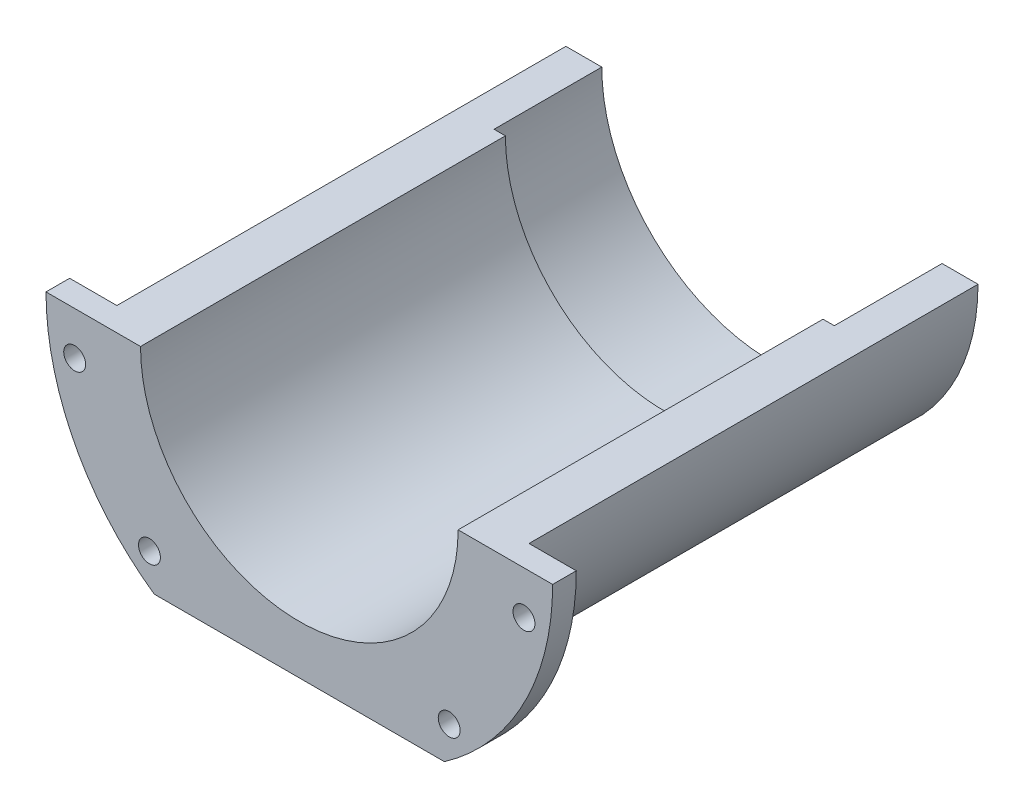
ISO-10303-21;
HEADER;
FILE_DESCRIPTION(('STEP AP214'),'2;1');
FILE_NAME('part.step','',(''),(''),'','','');
FILE_SCHEMA(('AUTOMOTIVE_DESIGN { 1 0 10303 214 1 1 1 1 }'));
ENDSEC;
DATA;
#1=APPLICATION_CONTEXT('core data for automotive mechanical design processes');
#2=APPLICATION_PROTOCOL_DEFINITION('international standard','automotive_design',2000,#1);
#3=PRODUCT_CONTEXT('',#1,'mechanical');
#4=PRODUCT('Part','Part','',(#3));
#5=PRODUCT_RELATED_PRODUCT_CATEGORY('part','',(#4));
#6=PRODUCT_DEFINITION_FORMATION('','',#4);
#7=PRODUCT_DEFINITION_CONTEXT('part definition',#1,'design');
#8=PRODUCT_DEFINITION('design','',#6,#7);
#9=PRODUCT_DEFINITION_SHAPE('','',#8);
#10=(LENGTH_UNIT() NAMED_UNIT(*) SI_UNIT(.MILLI.,.METRE.));
#11=(NAMED_UNIT(*) PLANE_ANGLE_UNIT() SI_UNIT($,.RADIAN.));
#12=(NAMED_UNIT(*) SI_UNIT($,.STERADIAN.) SOLID_ANGLE_UNIT());
#13=UNCERTAINTY_MEASURE_WITH_UNIT(LENGTH_MEASURE(1.E-05),#10,'distance_accuracy_value','');
#14=(GEOMETRIC_REPRESENTATION_CONTEXT(3) GLOBAL_UNCERTAINTY_ASSIGNED_CONTEXT((#13)) GLOBAL_UNIT_ASSIGNED_CONTEXT((#10,
#11,#12)) REPRESENTATION_CONTEXT('',''));
#15=CARTESIAN_POINT('',(0.,0.,0.));
#16=DIRECTION('',(0.,0.,1.));
#17=DIRECTION('',(1.,0.,0.));
#18=AXIS2_PLACEMENT_3D('',#15,#16,#17);
#19=CARTESIAN_POINT('',(0.,0.,63.5));
#20=DIRECTION('',(0.,0.,-1.));
#21=DIRECTION('',(-1.,0.,0.));
#22=AXIS2_PLACEMENT_3D('',#19,#20,#21);
#23=CYLINDRICAL_SURFACE('',#22,21.336);
#24=DIRECTION('',(0.,0.,-1.));
#25=VECTOR('',#24,1.);
#26=CARTESIAN_POINT('',(21.336,0.,63.5));
#27=LINE('',#26,#25);
#28=CARTESIAN_POINT('',(21.336,0.,14.478));
#29=VERTEX_POINT('',#28);
#30=CARTESIAN_POINT('',(21.336,0.,63.5));
#31=VERTEX_POINT('',#30);
#32=EDGE_CURVE('E152',#29,#31,#27,.F.);
#33=ORIENTED_EDGE('',*,*,#32,.F.);
#34=CARTESIAN_POINT('',(0.,0.,14.478));
#35=DIRECTION('',(0.,0.,-1.));
#36=DIRECTION('',(-1.,0.,0.));
#37=AXIS2_PLACEMENT_3D('',#34,#35,#36);
#38=CIRCLE('',#37,21.336);
#39=CARTESIAN_POINT('',(-21.336,0.,14.478));
#40=VERTEX_POINT('',#39);
#41=EDGE_CURVE('E198',#29,#40,#38,.T.);
#42=ORIENTED_EDGE('',*,*,#41,.T.);
#43=DIRECTION('',(0.,0.,-1.));
#44=VECTOR('',#43,1.);
#45=CARTESIAN_POINT('',(-21.336,0.,63.5));
#46=LINE('',#45,#44);
#47=CARTESIAN_POINT('',(-21.336,0.,63.5));
#48=VERTEX_POINT('',#47);
#49=EDGE_CURVE('E143',#48,#40,#46,.T.);
#50=ORIENTED_EDGE('',*,*,#49,.F.);
#51=CARTESIAN_POINT('',(0.,0.,63.5));
#52=DIRECTION('',(0.,0.,1.));
#53=DIRECTION('',(1.,0.,0.));
#54=AXIS2_PLACEMENT_3D('',#51,#52,#53);
#55=CIRCLE('',#54,21.336);
#56=EDGE_CURVE('E215',#48,#31,#55,.T.);
#57=ORIENTED_EDGE('',*,*,#56,.T.);
#58=EDGE_LOOP('',(#33,#42,#50,#57));
#59=FACE_BOUND('',#58,.T.);
#60=ADVANCED_FACE('F44',(#59),#23,.F.);
#61=CARTESIAN_POINT('',(0.,0.,60.325));
#62=DIRECTION('',(0.,0.,1.));
#63=DIRECTION('',(1.,0.,0.));
#64=AXIS2_PLACEMENT_3D('',#61,#62,#63);
#65=CYLINDRICAL_SURFACE('',#64,34.036);
#66=DIRECTION('',(0.,0.,1.));
#67=VECTOR('',#66,1.);
#68=CARTESIAN_POINT('',(-19.4962163427083,-27.8988681547892,60.325));
#69=LINE('',#68,#67);
#70=CARTESIAN_POINT('',(-19.4962163427083,-27.8988681547892,63.5));
#71=VERTEX_POINT('',#70);
#72=CARTESIAN_POINT('',(-19.4962163427083,-27.8988681547892,60.325));
#73=VERTEX_POINT('',#72);
#74=EDGE_CURVE('E66',#71,#73,#69,.F.);
#75=ORIENTED_EDGE('',*,*,#74,.F.);
#76=CARTESIAN_POINT('',(0.,0.,63.5));
#77=DIRECTION('',(0.,0.,1.));
#78=DIRECTION('',(1.,0.,0.));
#79=AXIS2_PLACEMENT_3D('',#76,#77,#78);
#80=CIRCLE('',#79,34.036);
#81=CARTESIAN_POINT('',(-34.036,0.,63.5));
#82=VERTEX_POINT('',#81);
#83=EDGE_CURVE('E141',#82,#71,#80,.T.);
#84=ORIENTED_EDGE('',*,*,#83,.F.);
#85=DIRECTION('',(0.,0.,1.));
#86=VECTOR('',#85,1.);
#87=CARTESIAN_POINT('',(-34.036,0.,60.325));
#88=LINE('',#87,#86);
#89=CARTESIAN_POINT('',(-34.036,0.,60.325));
#90=VERTEX_POINT('',#89);
#91=EDGE_CURVE('E147',#90,#82,#88,.T.);
#92=ORIENTED_EDGE('',*,*,#91,.F.);
#93=CARTESIAN_POINT('',(0.,0.,60.325));
#94=DIRECTION('',(0.,0.,1.));
#95=DIRECTION('',(1.,0.,0.));
#96=AXIS2_PLACEMENT_3D('',#93,#94,#95);
#97=CIRCLE('',#96,34.036);
#98=EDGE_CURVE('E210',#90,#73,#97,.T.);
#99=ORIENTED_EDGE('',*,*,#98,.T.);
#100=EDGE_LOOP('',(#75,#84,#92,#99));
#101=FACE_BOUND('',#100,.T.);
#102=ADVANCED_FACE('F232',(#101),#65,.T.);
#103=CARTESIAN_POINT('',(0.,0.,63.5));
#104=DIRECTION('',(0.,0.,-1.));
#105=DIRECTION('',(-1.,0.,0.));
#106=AXIS2_PLACEMENT_3D('',#103,#104,#105);
#107=CYLINDRICAL_SURFACE('',#106,27.686);
#108=CARTESIAN_POINT('',(0.,0.,60.325));
#109=DIRECTION('',(0.,0.,1.));
#110=DIRECTION('',(1.,0.,0.));
#111=AXIS2_PLACEMENT_3D('',#108,#109,#110);
#112=CIRCLE('',#111,27.686);
#113=CARTESIAN_POINT('',(-27.686,0.,60.325));
#114=VERTEX_POINT('',#113);
#115=CARTESIAN_POINT('',(27.686,0.,60.325));
#116=VERTEX_POINT('',#115);
#117=EDGE_CURVE('E217',#114,#116,#112,.T.);
#118=ORIENTED_EDGE('',*,*,#117,.F.);
#119=DIRECTION('',(0.,0.,-1.));
#120=VECTOR('',#119,1.);
#121=CARTESIAN_POINT('',(-27.686,0.,63.5));
#122=LINE('',#121,#120);
#123=CARTESIAN_POINT('',(-27.686,0.,0.));
#124=VERTEX_POINT('',#123);
#125=EDGE_CURVE('E138',#114,#124,#122,.T.);
#126=ORIENTED_EDGE('',*,*,#125,.T.);
#127=CARTESIAN_POINT('',(0.,0.,0.));
#128=DIRECTION('',(0.,0.,1.));
#129=DIRECTION('',(1.,0.,0.));
#130=AXIS2_PLACEMENT_3D('',#127,#128,#129);
#131=CIRCLE('',#130,27.686);
#132=CARTESIAN_POINT('',(27.686,0.,0.));
#133=VERTEX_POINT('',#132);
#134=EDGE_CURVE('E136',#124,#133,#131,.T.);
#135=ORIENTED_EDGE('',*,*,#134,.T.);
#136=DIRECTION('',(0.,0.,-1.));
#137=VECTOR('',#136,1.);
#138=CARTESIAN_POINT('',(27.686,0.,63.5));
#139=LINE('',#138,#137);
#140=EDGE_CURVE('E148',#133,#116,#139,.F.);
#141=ORIENTED_EDGE('',*,*,#140,.T.);
#142=EDGE_LOOP('',(#118,#126,#135,#141));
#143=FACE_BOUND('',#142,.T.);
#144=ADVANCED_FACE('F229',(#143),#107,.T.);
#145=CARTESIAN_POINT('',(0.,0.,63.5));
#146=DIRECTION('',(0.,0.,1.));
#147=DIRECTION('',(1.,0.,0.));
#148=AXIS2_PLACEMENT_3D('',#145,#146,#147);
#149=PLANE('',#148);
#150=DIRECTION('',(-1.,0.,0.));
#151=VECTOR('',#150,1.);
#152=CARTESIAN_POINT('',(0.,-27.8988681547892,63.5));
#153=LINE('',#152,#151);
#154=CARTESIAN_POINT('',(19.4962163427083,-27.8988681547892,63.5));
#155=VERTEX_POINT('',#154);
#156=EDGE_CURVE('E189',#155,#71,#153,.T.);
#157=ORIENTED_EDGE('',*,*,#156,.F.);
#158=CARTESIAN_POINT('',(34.036,0.,63.5));
#159=VERTEX_POINT('',#158);
#160=EDGE_CURVE('E137',#155,#159,#80,.T.);
#161=ORIENTED_EDGE('',*,*,#160,.T.);
#162=DIRECTION('',(1.,0.,0.));
#163=VECTOR('',#162,1.);
#164=CARTESIAN_POINT('',(0.,0.,63.5));
#165=LINE('',#164,#163);
#166=EDGE_CURVE('E156',#31,#159,#165,.T.);
#167=ORIENTED_EDGE('',*,*,#166,.F.);
#168=ORIENTED_EDGE('',*,*,#56,.F.);
#169=EDGE_CURVE('E150',#82,#48,#165,.T.);
#170=ORIENTED_EDGE('',*,*,#169,.F.);
#171=ORIENTED_EDGE('',*,*,#83,.T.);
#172=EDGE_LOOP('',(#157,#161,#167,#168,#170,#171));
#173=FACE_BOUND('',#172,.T.);
#174=CARTESIAN_POINT('',(30.1839089543415,-5.78978251153393,63.5));
#175=DIRECTION('',(0.,0.,1.));
#176=DIRECTION('',(1.,0.,0.));
#177=AXIS2_PLACEMENT_3D('',#174,#175,#176);
#178=CIRCLE('',#177,1.4732);
#179=CARTESIAN_POINT('',(31.6571089543415,-5.78978251153393,63.5));
#180=VERTEX_POINT('',#179);
#181=EDGE_CURVE('E164',#180,#180,#178,.T.);
#182=ORIENTED_EDGE('',*,*,#181,.F.);
#183=EDGE_LOOP('',(#182));
#184=FACE_BOUND('',#183,.T.);
#185=CARTESIAN_POINT('',(-30.1839089543415,-5.78978251153393,63.5));
#186=DIRECTION('',(0.,0.,1.));
#187=DIRECTION('',(1.,0.,0.));
#188=AXIS2_PLACEMENT_3D('',#185,#186,#187);
#189=CIRCLE('',#188,1.4732);
#190=CARTESIAN_POINT('',(-28.7107089543415,-5.78978251153393,63.5));
#191=VERTEX_POINT('',#190);
#192=EDGE_CURVE('E167',#191,#191,#189,.T.);
#193=ORIENTED_EDGE('',*,*,#192,.F.);
#194=EDGE_LOOP('',(#193));
#195=FACE_BOUND('',#194,.T.);
#196=CARTESIAN_POINT('',(-20.1371679323559,-23.2181913369439,63.5));
#197=DIRECTION('',(0.,0.,1.));
#198=DIRECTION('',(1.,0.,0.));
#199=AXIS2_PLACEMENT_3D('',#196,#197,#198);
#200=CIRCLE('',#199,1.4732);
#201=CARTESIAN_POINT('',(-18.6639679323559,-23.2181913369439,63.5));
#202=VERTEX_POINT('',#201);
#203=EDGE_CURVE('E170',#202,#202,#200,.T.);
#204=ORIENTED_EDGE('',*,*,#203,.F.);
#205=EDGE_LOOP('',(#204));
#206=FACE_BOUND('',#205,.T.);
#207=CARTESIAN_POINT('',(20.1371679323559,-23.2181913369439,63.5));
#208=DIRECTION('',(0.,0.,1.));
#209=DIRECTION('',(1.,0.,0.));
#210=AXIS2_PLACEMENT_3D('',#207,#208,#209);
#211=CIRCLE('',#210,1.4732);
#212=CARTESIAN_POINT('',(21.6103679323559,-23.2181913369439,63.5));
#213=VERTEX_POINT('',#212);
#214=EDGE_CURVE('E173',#213,#213,#211,.T.);
#215=ORIENTED_EDGE('',*,*,#214,.F.);
#216=EDGE_LOOP('',(#215));
#217=FACE_BOUND('',#216,.T.);
#218=ADVANCED_FACE('F231',(#173,#184,#195,#206,#217),#149,.T.);
#219=CARTESIAN_POINT('',(0.,0.,0.));
#220=DIRECTION('',(0.,0.,1.));
#221=DIRECTION('',(1.,0.,0.));
#222=AXIS2_PLACEMENT_3D('',#219,#220,#221);
#223=PLANE('',#222);
#224=DIRECTION('',(1.,0.,0.));
#225=VECTOR('',#224,1.);
#226=CARTESIAN_POINT('',(0.,0.,0.));
#227=LINE('',#226,#225);
#228=CARTESIAN_POINT('',(-22.86,0.,0.));
#229=VERTEX_POINT('',#228);
#230=EDGE_CURVE('E130',#124,#229,#227,.T.);
#231=ORIENTED_EDGE('',*,*,#230,.T.);
#232=CARTESIAN_POINT('',(0.,0.,0.));
#233=DIRECTION('',(0.,0.,-1.));
#234=DIRECTION('',(-1.,0.,0.));
#235=AXIS2_PLACEMENT_3D('',#232,#233,#234);
#236=CIRCLE('',#235,22.86);
#237=CARTESIAN_POINT('',(22.86,0.,0.));
#238=VERTEX_POINT('',#237);
#239=EDGE_CURVE('E119',#238,#229,#236,.T.);
#240=ORIENTED_EDGE('',*,*,#239,.F.);
#241=EDGE_CURVE('E140',#238,#133,#227,.T.);
#242=ORIENTED_EDGE('',*,*,#241,.T.);
#243=ORIENTED_EDGE('',*,*,#134,.F.);
#244=EDGE_LOOP('',(#231,#240,#242,#243));
#245=FACE_BOUND('',#244,.T.);
#246=ADVANCED_FACE('F134',(#245),#223,.F.);
#247=DIRECTION('',(0.,0.,1.));
#248=VECTOR('',#247,1.);
#249=CARTESIAN_POINT('',(19.4962163427083,-27.8988681547892,60.325));
#250=LINE('',#249,#248);
#251=CARTESIAN_POINT('',(19.4962163427083,-27.8988681547892,60.325));
#252=VERTEX_POINT('',#251);
#253=EDGE_CURVE('E191',#252,#155,#250,.T.);
#254=ORIENTED_EDGE('',*,*,#253,.F.);
#255=CARTESIAN_POINT('',(34.036,0.,60.325));
#256=VERTEX_POINT('',#255);
#257=EDGE_CURVE('E212',#252,#256,#97,.T.);
#258=ORIENTED_EDGE('',*,*,#257,.T.);
#259=DIRECTION('',(0.,0.,1.));
#260=VECTOR('',#259,1.);
#261=CARTESIAN_POINT('',(34.036,0.,60.325));
#262=LINE('',#261,#260);
#263=EDGE_CURVE('E161',#159,#256,#262,.F.);
#264=ORIENTED_EDGE('',*,*,#263,.F.);
#265=ORIENTED_EDGE('',*,*,#160,.F.);
#266=EDGE_LOOP('',(#254,#258,#264,#265));
#267=FACE_BOUND('',#266,.T.);
#268=ADVANCED_FACE('F242',(#267),#65,.T.);
#269=CARTESIAN_POINT('',(0.,0.,60.325));
#270=DIRECTION('',(0.,0.,1.));
#271=DIRECTION('',(1.,0.,0.));
#272=AXIS2_PLACEMENT_3D('',#269,#270,#271);
#273=PLANE('',#272);
#274=CARTESIAN_POINT('',(30.1839089543415,-5.78978251153393,60.325));
#275=DIRECTION('',(0.,0.,-1.));
#276=DIRECTION('',(-1.,0.,0.));
#277=AXIS2_PLACEMENT_3D('',#274,#275,#276);
#278=CIRCLE('',#277,1.4732);
#279=CARTESIAN_POINT('',(28.7107089543415,-5.78978251153393,60.325));
#280=VERTEX_POINT('',#279);
#281=EDGE_CURVE('E176',#280,#280,#278,.T.);
#282=ORIENTED_EDGE('',*,*,#281,.F.);
#283=EDGE_LOOP('',(#282));
#284=FACE_BOUND('',#283,.T.);
#285=CARTESIAN_POINT('',(-30.1839089543415,-5.78978251153393,60.325));
#286=DIRECTION('',(0.,0.,-1.));
#287=DIRECTION('',(-1.,0.,0.));
#288=AXIS2_PLACEMENT_3D('',#285,#286,#287);
#289=CIRCLE('',#288,1.4732);
#290=CARTESIAN_POINT('',(-31.6571089543415,-5.78978251153393,60.325));
#291=VERTEX_POINT('',#290);
#292=EDGE_CURVE('E181',#291,#291,#289,.T.);
#293=ORIENTED_EDGE('',*,*,#292,.F.);
#294=EDGE_LOOP('',(#293));
#295=FACE_BOUND('',#294,.T.);
#296=CARTESIAN_POINT('',(-20.1371679323559,-23.2181913369439,60.325));
#297=DIRECTION('',(0.,0.,-1.));
#298=DIRECTION('',(-1.,0.,0.));
#299=AXIS2_PLACEMENT_3D('',#296,#297,#298);
#300=CIRCLE('',#299,1.4732);
#301=CARTESIAN_POINT('',(-21.6103679323559,-23.2181913369439,60.325));
#302=VERTEX_POINT('',#301);
#303=EDGE_CURVE('E177',#302,#302,#300,.T.);
#304=ORIENTED_EDGE('',*,*,#303,.F.);
#305=EDGE_LOOP('',(#304));
#306=FACE_BOUND('',#305,.T.);
#307=CARTESIAN_POINT('',(20.1371679323559,-23.2181913369439,60.325));
#308=DIRECTION('',(0.,0.,-1.));
#309=DIRECTION('',(-1.,0.,0.));
#310=AXIS2_PLACEMENT_3D('',#307,#308,#309);
#311=CIRCLE('',#310,1.4732);
#312=CARTESIAN_POINT('',(18.6639679323559,-23.2181913369439,60.325));
#313=VERTEX_POINT('',#312);
#314=EDGE_CURVE('E180',#313,#313,#311,.T.);
#315=ORIENTED_EDGE('',*,*,#314,.F.);
#316=EDGE_LOOP('',(#315));
#317=FACE_BOUND('',#316,.T.);
#318=ORIENTED_EDGE('',*,*,#257,.F.);
#319=DIRECTION('',(1.,0.,0.));
#320=VECTOR('',#319,1.);
#321=CARTESIAN_POINT('',(22.9354742737972,-27.8988681547892,60.325));
#322=LINE('',#321,#320);
#323=EDGE_CURVE('E193',#73,#252,#322,.T.);
#324=ORIENTED_EDGE('',*,*,#323,.F.);
#325=ORIENTED_EDGE('',*,*,#98,.F.);
#326=DIRECTION('',(1.,0.,0.));
#327=VECTOR('',#326,1.);
#328=CARTESIAN_POINT('',(0.,0.,60.325));
#329=LINE('',#328,#327);
#330=EDGE_CURVE('E222',#90,#114,#329,.T.);
#331=ORIENTED_EDGE('',*,*,#330,.T.);
#332=ORIENTED_EDGE('',*,*,#117,.T.);
#333=EDGE_CURVE('E220',#116,#256,#329,.T.);
#334=ORIENTED_EDGE('',*,*,#333,.T.);
#335=EDGE_LOOP('',(#318,#324,#325,#331,#332,#334));
#336=FACE_BOUND('',#335,.T.);
#337=ADVANCED_FACE('F227',(#284,#295,#306,#317,#336),#273,.F.);
#338=CARTESIAN_POINT('',(45.3508252416647,0.,161.925));
#339=DIRECTION('',(0.,-1.,0.));
#340=DIRECTION('',(0.,0.,-1.));
#341=AXIS2_PLACEMENT_3D('',#338,#339,#340);
#342=PLANE('',#341);
#343=ORIENTED_EDGE('',*,*,#241,.F.);
#344=DIRECTION('',(0.,0.,-1.));
#345=VECTOR('',#344,1.);
#346=CARTESIAN_POINT('',(22.86,0.,14.478));
#347=LINE('',#346,#345);
#348=CARTESIAN_POINT('',(22.86,0.,14.478));
#349=VERTEX_POINT('',#348);
#350=EDGE_CURVE('E123',#238,#349,#347,.F.);
#351=ORIENTED_EDGE('',*,*,#350,.T.);
#352=DIRECTION('',(1.,0.,0.));
#353=VECTOR('',#352,1.);
#354=CARTESIAN_POINT('',(45.3508252416647,0.,14.478));
#355=LINE('',#354,#353);
#356=EDGE_CURVE('E196',#29,#349,#355,.T.);
#357=ORIENTED_EDGE('',*,*,#356,.F.);
#358=ORIENTED_EDGE('',*,*,#32,.T.);
#359=ORIENTED_EDGE('',*,*,#166,.T.);
#360=ORIENTED_EDGE('',*,*,#263,.T.);
#361=ORIENTED_EDGE('',*,*,#333,.F.);
#362=ORIENTED_EDGE('',*,*,#140,.F.);
#363=EDGE_LOOP('',(#343,#351,#357,#358,#359,#360,#361,#362));
#364=FACE_BOUND('',#363,.T.);
#365=ADVANCED_FACE('F265',(#364),#342,.F.);
#366=DIRECTION('',(1.,0.,0.));
#367=VECTOR('',#366,1.);
#368=CARTESIAN_POINT('',(45.3508252416647,0.,14.478));
#369=LINE('',#368,#367);
#370=CARTESIAN_POINT('',(-22.86,0.,14.478));
#371=VERTEX_POINT('',#370);
#372=EDGE_CURVE('E51',#371,#40,#369,.T.);
#373=ORIENTED_EDGE('',*,*,#372,.F.);
#374=DIRECTION('',(0.,0.,-1.));
#375=VECTOR('',#374,1.);
#376=CARTESIAN_POINT('',(-22.86,0.,14.478));
#377=LINE('',#376,#375);
#378=EDGE_CURVE('E11',#371,#229,#377,.T.);
#379=ORIENTED_EDGE('',*,*,#378,.T.);
#380=ORIENTED_EDGE('',*,*,#230,.F.);
#381=ORIENTED_EDGE('',*,*,#125,.F.);
#382=ORIENTED_EDGE('',*,*,#330,.F.);
#383=ORIENTED_EDGE('',*,*,#91,.T.);
#384=ORIENTED_EDGE('',*,*,#169,.T.);
#385=ORIENTED_EDGE('',*,*,#49,.T.);
#386=EDGE_LOOP('',(#373,#379,#380,#381,#382,#383,#384,#385));
#387=FACE_BOUND('',#386,.T.);
#388=ADVANCED_FACE('F129',(#387),#342,.F.);
#389=CARTESIAN_POINT('',(20.1371679323559,-23.2181913369439,161.925));
#390=DIRECTION('',(0.,0.,-1.));
#391=DIRECTION('',(-1.,0.,0.));
#392=AXIS2_PLACEMENT_3D('',#389,#390,#391);
#393=CYLINDRICAL_SURFACE('',#392,1.4732);
#394=ORIENTED_EDGE('',*,*,#214,.T.);
#395=EDGE_LOOP('',(#394));
#396=FACE_BOUND('',#395,.T.);
#397=ORIENTED_EDGE('',*,*,#314,.T.);
#398=EDGE_LOOP('',(#397));
#399=FACE_BOUND('',#398,.T.);
#400=ADVANCED_FACE('F278',(#396,#399),#393,.F.);
#401=CARTESIAN_POINT('',(-20.1371679323559,-23.2181913369439,161.925));
#402=DIRECTION('',(0.,0.,-1.));
#403=DIRECTION('',(-1.,0.,0.));
#404=AXIS2_PLACEMENT_3D('',#401,#402,#403);
#405=CYLINDRICAL_SURFACE('',#404,1.4732);
#406=ORIENTED_EDGE('',*,*,#203,.T.);
#407=EDGE_LOOP('',(#406));
#408=FACE_BOUND('',#407,.T.);
#409=ORIENTED_EDGE('',*,*,#303,.T.);
#410=EDGE_LOOP('',(#409));
#411=FACE_BOUND('',#410,.T.);
#412=ADVANCED_FACE('F307',(#408,#411),#405,.F.);
#413=CARTESIAN_POINT('',(-30.1839089543415,-5.78978251153393,161.925));
#414=DIRECTION('',(0.,0.,-1.));
#415=DIRECTION('',(-1.,0.,0.));
#416=AXIS2_PLACEMENT_3D('',#413,#414,#415);
#417=CYLINDRICAL_SURFACE('',#416,1.4732);
#418=ORIENTED_EDGE('',*,*,#192,.T.);
#419=EDGE_LOOP('',(#418));
#420=FACE_BOUND('',#419,.T.);
#421=ORIENTED_EDGE('',*,*,#292,.T.);
#422=EDGE_LOOP('',(#421));
#423=FACE_BOUND('',#422,.T.);
#424=ADVANCED_FACE('F303',(#420,#423),#417,.F.);
#425=CARTESIAN_POINT('',(30.1839089543415,-5.78978251153393,161.925));
#426=DIRECTION('',(0.,0.,-1.));
#427=DIRECTION('',(-1.,0.,0.));
#428=AXIS2_PLACEMENT_3D('',#425,#426,#427);
#429=CYLINDRICAL_SURFACE('',#428,1.4732);
#430=ORIENTED_EDGE('',*,*,#181,.T.);
#431=EDGE_LOOP('',(#430));
#432=FACE_BOUND('',#431,.T.);
#433=ORIENTED_EDGE('',*,*,#281,.T.);
#434=EDGE_LOOP('',(#433));
#435=FACE_BOUND('',#434,.T.);
#436=ADVANCED_FACE('F300',(#432,#435),#429,.F.);
#437=CARTESIAN_POINT('',(22.9354742737972,-27.8988681547892,161.925));
#438=DIRECTION('',(0.,1.,0.));
#439=DIRECTION('',(0.,0.,1.));
#440=AXIS2_PLACEMENT_3D('',#437,#438,#439);
#441=PLANE('',#440);
#442=ORIENTED_EDGE('',*,*,#74,.T.);
#443=ORIENTED_EDGE('',*,*,#323,.T.);
#444=ORIENTED_EDGE('',*,*,#253,.T.);
#445=ORIENTED_EDGE('',*,*,#156,.T.);
#446=EDGE_LOOP('',(#442,#443,#444,#445));
#447=FACE_BOUND('',#446,.T.);
#448=ADVANCED_FACE('F253',(#447),#441,.F.);
#449=CARTESIAN_POINT('',(0.,0.,14.478));
#450=DIRECTION('',(0.,0.,-1.));
#451=DIRECTION('',(-1.,0.,0.));
#452=AXIS2_PLACEMENT_3D('',#449,#450,#451);
#453=CYLINDRICAL_SURFACE('',#452,22.86);
#454=ORIENTED_EDGE('',*,*,#239,.T.);
#455=ORIENTED_EDGE('',*,*,#378,.F.);
#456=CARTESIAN_POINT('',(0.,0.,14.478));
#457=DIRECTION('',(0.,0.,-1.));
#458=DIRECTION('',(-1.,0.,0.));
#459=AXIS2_PLACEMENT_3D('',#456,#457,#458);
#460=CIRCLE('',#459,22.86);
#461=EDGE_CURVE('E58',#349,#371,#460,.T.);
#462=ORIENTED_EDGE('',*,*,#461,.F.);
#463=ORIENTED_EDGE('',*,*,#350,.F.);
#464=EDGE_LOOP('',(#454,#455,#462,#463));
#465=FACE_BOUND('',#464,.T.);
#466=ADVANCED_FACE('F120',(#465),#453,.F.);
#467=CARTESIAN_POINT('',(0.,0.,14.478));
#468=DIRECTION('',(0.,0.,-1.));
#469=DIRECTION('',(-1.,0.,0.));
#470=AXIS2_PLACEMENT_3D('',#467,#468,#469);
#471=PLANE('',#470);
#472=ORIENTED_EDGE('',*,*,#356,.T.);
#473=ORIENTED_EDGE('',*,*,#461,.T.);
#474=ORIENTED_EDGE('',*,*,#372,.T.);
#475=ORIENTED_EDGE('',*,*,#41,.F.);
#476=EDGE_LOOP('',(#472,#473,#474,#475));
#477=FACE_BOUND('',#476,.T.);
#478=ADVANCED_FACE('F286',(#477),#471,.T.);
#479=CLOSED_SHELL('',(#60,#102,#144,#218,#246,#268,#337,#365,#388,#400,#412,#424,#436,#448,#466,#478));
#480=MANIFOLD_SOLID_BREP('B2',#479);
#481=ADVANCED_BREP_SHAPE_REPRESENTATION('',(#18,#480),#14);
#482=SHAPE_DEFINITION_REPRESENTATION(#9,#481);
ENDSEC;
END-ISO-10303-21;
